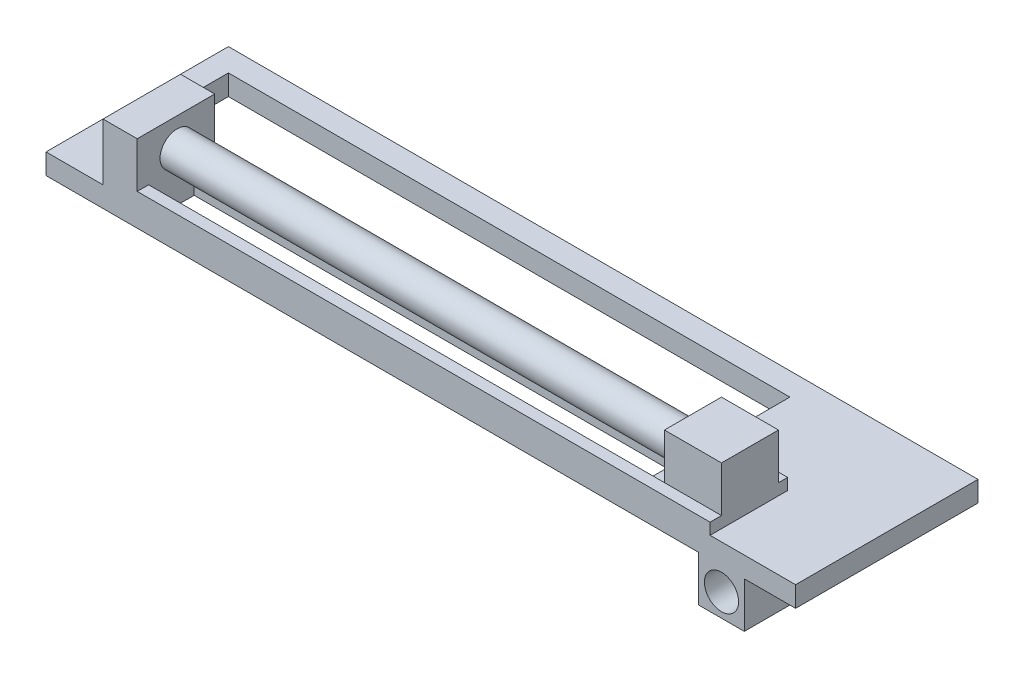
ISO-10303-21;
HEADER;
FILE_DESCRIPTION(('STEP AP214'),'2;1');
FILE_NAME('part.step','',(''),(''),'','','');
FILE_SCHEMA(('AUTOMOTIVE_DESIGN { 1 0 10303 214 1 1 1 1 }'));
ENDSEC;
DATA;
#1=APPLICATION_CONTEXT('core data for automotive mechanical design processes');
#2=APPLICATION_PROTOCOL_DEFINITION('international standard','automotive_design',2000,#1);
#3=PRODUCT_CONTEXT('',#1,'mechanical');
#4=PRODUCT('Part','Part','',(#3));
#5=PRODUCT_RELATED_PRODUCT_CATEGORY('part','',(#4));
#6=PRODUCT_DEFINITION_FORMATION('','',#4);
#7=PRODUCT_DEFINITION_CONTEXT('part definition',#1,'design');
#8=PRODUCT_DEFINITION('design','',#6,#7);
#9=PRODUCT_DEFINITION_SHAPE('','',#8);
#10=(LENGTH_UNIT() NAMED_UNIT(*) SI_UNIT(.MILLI.,.METRE.));
#11=(NAMED_UNIT(*) PLANE_ANGLE_UNIT() SI_UNIT($,.RADIAN.));
#12=(NAMED_UNIT(*) SI_UNIT($,.STERADIAN.) SOLID_ANGLE_UNIT());
#13=UNCERTAINTY_MEASURE_WITH_UNIT(LENGTH_MEASURE(1.E-05),#10,'distance_accuracy_value','');
#14=(GEOMETRIC_REPRESENTATION_CONTEXT(3) GLOBAL_UNCERTAINTY_ASSIGNED_CONTEXT((#13)) GLOBAL_UNIT_ASSIGNED_CONTEXT((#10,
#11,#12)) REPRESENTATION_CONTEXT('',''));
#15=CARTESIAN_POINT('',(0.,0.,0.));
#16=DIRECTION('',(0.,0.,1.));
#17=DIRECTION('',(1.,0.,0.));
#18=AXIS2_PLACEMENT_3D('',#15,#16,#17);
#19=CARTESIAN_POINT('',(0.,3.6,-4.));
#20=DIRECTION('',(0.,-1.,0.));
#21=DIRECTION('',(0.,0.,-1.));
#22=AXIS2_PLACEMENT_3D('',#19,#20,#21);
#23=PLANE('',#22);
#24=DIRECTION('',(1.,0.,0.));
#25=VECTOR('',#24,1.);
#26=CARTESIAN_POINT('',(16.,3.6,-12.));
#27=LINE('',#26,#25);
#28=CARTESIAN_POINT('',(16.,3.6,-12.));
#29=VERTEX_POINT('',#28);
#30=CARTESIAN_POINT('',(106.5,3.6,-12.));
#31=VERTEX_POINT('',#30);
#32=EDGE_CURVE('E476',#29,#31,#27,.T.);
#33=ORIENTED_EDGE('',*,*,#32,.F.);
#34=DIRECTION('',(0.,0.,1.));
#35=VECTOR('',#34,1.);
#36=CARTESIAN_POINT('',(16.,3.6,-13.6));
#37=LINE('',#36,#35);
#38=CARTESIAN_POINT('',(16.,3.6,-10.));
#39=VERTEX_POINT('',#38);
#40=EDGE_CURVE('E249',#29,#39,#37,.T.);
#41=ORIENTED_EDGE('',*,*,#40,.T.);
#42=DIRECTION('',(1.,0.,0.));
#43=VECTOR('',#42,1.);
#44=CARTESIAN_POINT('',(-0.002000000000002,3.6,-10.));
#45=LINE('',#44,#43);
#46=CARTESIAN_POINT('',(102.5,3.6,-10.));
#47=VERTEX_POINT('',#46);
#48=EDGE_CURVE('E348',#39,#47,#45,.T.);
#49=ORIENTED_EDGE('',*,*,#48,.T.);
#50=DIRECTION('',(0.,0.,1.));
#51=VECTOR('',#50,1.);
#52=CARTESIAN_POINT('',(102.5,3.6,-32.002));
#53=LINE('',#52,#51);
#54=CARTESIAN_POINT('',(102.5,3.6,-4.));
#55=VERTEX_POINT('',#54);
#56=EDGE_CURVE('E367',#47,#55,#53,.T.);
#57=ORIENTED_EDGE('',*,*,#56,.T.);
#58=DIRECTION('',(1.,0.,0.));
#59=VECTOR('',#58,1.);
#60=CARTESIAN_POINT('',(0.,3.6,-4.));
#61=LINE('',#60,#59);
#62=CARTESIAN_POINT('',(16.,3.6,-4.));
#63=VERTEX_POINT('',#62);
#64=EDGE_CURVE('E428',#63,#55,#61,.T.);
#65=ORIENTED_EDGE('',*,*,#64,.F.);
#66=CARTESIAN_POINT('',(16.,3.6,-2.));
#67=VERTEX_POINT('',#66);
#68=EDGE_CURVE('E292',#63,#67,#37,.T.);
#69=ORIENTED_EDGE('',*,*,#68,.T.);
#70=DIRECTION('',(1.,0.,0.));
#71=VECTOR('',#70,1.);
#72=CARTESIAN_POINT('',(16.,3.6,-2.));
#73=LINE('',#72,#71);
#74=CARTESIAN_POINT('',(106.5,3.6,-2.));
#75=VERTEX_POINT('',#74);
#76=EDGE_CURVE('E252',#67,#75,#73,.T.);
#77=ORIENTED_EDGE('',*,*,#76,.T.);
#78=DIRECTION('',(0.,0.,1.));
#79=VECTOR('',#78,1.);
#80=CARTESIAN_POINT('',(106.5,3.6,-12.));
#81=LINE('',#80,#79);
#82=EDGE_CURVE('E315',#31,#75,#81,.T.);
#83=ORIENTED_EDGE('',*,*,#82,.F.);
#84=EDGE_LOOP('',(#33,#41,#49,#57,#65,#69,#77,#83));
#85=FACE_BOUND('',#84,.T.);
#86=ADVANCED_FACE('F38',(#85),#23,.F.);
#87=DIRECTION('',(-1.,0.,0.));
#88=VECTOR('',#87,1.);
#89=CARTESIAN_POINT('',(16.,3.6,-13.6));
#90=LINE('',#89,#88);
#91=CARTESIAN_POINT('',(116.5,3.6,-13.6));
#92=VERTEX_POINT('',#91);
#93=CARTESIAN_POINT('',(102.5,3.6,-13.6));
#94=VERTEX_POINT('',#93);
#95=EDGE_CURVE('E244',#92,#94,#90,.T.);
#96=ORIENTED_EDGE('',*,*,#95,.F.);
#97=DIRECTION('',(0.,0.,1.));
#98=VECTOR('',#97,1.);
#99=CARTESIAN_POINT('',(116.5,3.6,-12.));
#100=LINE('',#99,#98);
#101=CARTESIAN_POINT('',(116.5,3.6,0.));
#102=VERTEX_POINT('',#101);
#103=EDGE_CURVE('E311',#92,#102,#100,.T.);
#104=ORIENTED_EDGE('',*,*,#103,.T.);
#105=DIRECTION('',(1.,0.,0.));
#106=VECTOR('',#105,1.);
#107=CARTESIAN_POINT('',(0.,3.6,0.));
#108=LINE('',#107,#106);
#109=CARTESIAN_POINT('',(131.5,3.6,0.));
#110=VERTEX_POINT('',#109);
#111=EDGE_CURVE('E427',#102,#110,#108,.T.);
#112=ORIENTED_EDGE('',*,*,#111,.T.);
#113=DIRECTION('',(0.,0.,1.));
#114=VECTOR('',#113,1.);
#115=CARTESIAN_POINT('',(131.5,3.6,-4.));
#116=LINE('',#115,#114);
#117=CARTESIAN_POINT('',(131.5,3.6,-32.));
#118=VERTEX_POINT('',#117);
#119=EDGE_CURVE('E390',#118,#110,#116,.T.);
#120=ORIENTED_EDGE('',*,*,#119,.F.);
#121=DIRECTION('',(1.,0.,0.));
#122=VECTOR('',#121,1.);
#123=CARTESIAN_POINT('',(0.,3.6,-32.));
#124=LINE('',#123,#122);
#125=CARTESIAN_POINT('',(0.,3.6,-32.));
#126=VERTEX_POINT('',#125);
#127=EDGE_CURVE('E412',#126,#118,#124,.T.);
#128=ORIENTED_EDGE('',*,*,#127,.F.);
#129=DIRECTION('',(0.,0.,1.));
#130=VECTOR('',#129,1.);
#131=CARTESIAN_POINT('',(0.,3.6,-4.));
#132=LINE('',#131,#130);
#133=CARTESIAN_POINT('',(0.,3.6,0.));
#134=VERTEX_POINT('',#133);
#135=EDGE_CURVE('E433',#126,#134,#132,.T.);
#136=ORIENTED_EDGE('',*,*,#135,.T.);
#137=CARTESIAN_POINT('',(10.,3.6,0.));
#138=VERTEX_POINT('',#137);
#139=EDGE_CURVE('E434',#134,#138,#108,.T.);
#140=ORIENTED_EDGE('',*,*,#139,.T.);
#141=DIRECTION('',(0.,0.,1.));
#142=VECTOR('',#141,1.);
#143=CARTESIAN_POINT('',(10.,3.6,-13.6));
#144=LINE('',#143,#142);
#145=CARTESIAN_POINT('',(10.,3.6,-13.6));
#146=VERTEX_POINT('',#145);
#147=EDGE_CURVE('E278',#146,#138,#144,.T.);
#148=ORIENTED_EDGE('',*,*,#147,.F.);
#149=DIRECTION('',(1.,0.,0.));
#150=VECTOR('',#149,1.);
#151=CARTESIAN_POINT('',(-0.002000000000002,3.6,-13.6));
#152=LINE('',#151,#150);
#153=CARTESIAN_POINT('',(4.,3.6,-13.6));
#154=VERTEX_POINT('',#153);
#155=EDGE_CURVE('E350',#154,#146,#152,.T.);
#156=ORIENTED_EDGE('',*,*,#155,.F.);
#157=DIRECTION('',(0.,0.,1.));
#158=VECTOR('',#157,1.);
#159=CARTESIAN_POINT('',(4.,3.6,-32.));
#160=LINE('',#159,#158);
#161=CARTESIAN_POINT('',(4.,3.6,-28.));
#162=VERTEX_POINT('',#161);
#163=EDGE_CURVE('E424',#162,#154,#160,.T.);
#164=ORIENTED_EDGE('',*,*,#163,.F.);
#165=DIRECTION('',(-1.,0.,0.));
#166=VECTOR('',#165,1.);
#167=CARTESIAN_POINT('',(132.881449618829,3.6,-28.));
#168=LINE('',#167,#166);
#169=CARTESIAN_POINT('',(102.5,3.6,-28.));
#170=VERTEX_POINT('',#169);
#171=EDGE_CURVE('E406',#170,#162,#168,.T.);
#172=ORIENTED_EDGE('',*,*,#171,.F.);
#173=EDGE_CURVE('E364',#170,#94,#53,.T.);
#174=ORIENTED_EDGE('',*,*,#173,.T.);
#175=EDGE_LOOP('',(#96,#104,#112,#120,#128,#136,#140,#148,#156,#164,#172,#174));
#176=FACE_BOUND('',#175,.T.);
#177=ADVANCED_FACE('F459',(#176),#23,.F.);
#178=CARTESIAN_POINT('',(16.,0.,0.00200000000000027));
#179=DIRECTION('',(-1.,0.,0.));
#180=DIRECTION('',(0.,0.,1.));
#181=AXIS2_PLACEMENT_3D('',#178,#179,#180);
#182=PLANE('',#181);
#183=CARTESIAN_POINT('',(16.,8.6,-7.));
#184=DIRECTION('',(-1.,0.,0.));
#185=DIRECTION('',(0.,0.,1.));
#186=AXIS2_PLACEMENT_3D('',#183,#184,#185);
#187=CIRCLE('',#186,3.);
#188=CARTESIAN_POINT('',(16.,8.6,-4.));
#189=VERTEX_POINT('',#188);
#190=EDGE_CURVE('E45',#189,#189,#187,.F.);
#191=ORIENTED_EDGE('',*,*,#190,.F.);
#192=EDGE_LOOP('',(#191));
#193=FACE_BOUND('',#192,.T.);
#194=DIRECTION('',(0.,-1.,0.));
#195=VECTOR('',#194,1.);
#196=CARTESIAN_POINT('',(16.,5.6,-12.));
#197=LINE('',#196,#195);
#198=CARTESIAN_POINT('',(16.,5.6,-12.));
#199=VERTEX_POINT('',#198);
#200=EDGE_CURVE('E232',#199,#29,#197,.T.);
#201=ORIENTED_EDGE('',*,*,#200,.F.);
#202=DIRECTION('',(0.,0.,1.));
#203=VECTOR('',#202,1.);
#204=CARTESIAN_POINT('',(16.,5.6,-13.6));
#205=LINE('',#204,#203);
#206=CARTESIAN_POINT('',(16.,5.6,-13.6));
#207=VERTEX_POINT('',#206);
#208=EDGE_CURVE('E240',#207,#199,#205,.T.);
#209=ORIENTED_EDGE('',*,*,#208,.F.);
#210=DIRECTION('',(0.,-1.,0.));
#211=VECTOR('',#210,1.);
#212=CARTESIAN_POINT('',(16.,13.6,-13.6));
#213=LINE('',#212,#211);
#214=CARTESIAN_POINT('',(16.,13.6,-13.6));
#215=VERTEX_POINT('',#214);
#216=EDGE_CURVE('E298',#215,#207,#213,.T.);
#217=ORIENTED_EDGE('',*,*,#216,.F.);
#218=DIRECTION('',(0.,0.,1.));
#219=VECTOR('',#218,1.);
#220=CARTESIAN_POINT('',(16.,13.6,-13.6));
#221=LINE('',#220,#219);
#222=CARTESIAN_POINT('',(16.,13.6,0.));
#223=VERTEX_POINT('',#222);
#224=EDGE_CURVE('E286',#215,#223,#221,.T.);
#225=ORIENTED_EDGE('',*,*,#224,.T.);
#226=DIRECTION('',(0.,-1.,0.));
#227=VECTOR('',#226,1.);
#228=CARTESIAN_POINT('',(16.,13.6,0.));
#229=LINE('',#228,#227);
#230=CARTESIAN_POINT('',(16.,5.6,0.));
#231=VERTEX_POINT('',#230);
#232=EDGE_CURVE('E294',#223,#231,#229,.T.);
#233=ORIENTED_EDGE('',*,*,#232,.T.);
#234=DIRECTION('',(0.,0.,-1.));
#235=VECTOR('',#234,1.);
#236=CARTESIAN_POINT('',(16.,5.6,0.));
#237=LINE('',#236,#235);
#238=CARTESIAN_POINT('',(16.,5.6,-2.));
#239=VERTEX_POINT('',#238);
#240=EDGE_CURVE('E264',#231,#239,#237,.T.);
#241=ORIENTED_EDGE('',*,*,#240,.T.);
#242=DIRECTION('',(0.,-1.,0.));
#243=VECTOR('',#242,1.);
#244=CARTESIAN_POINT('',(16.,5.6,-2.));
#245=LINE('',#244,#243);
#246=EDGE_CURVE('E270',#239,#67,#245,.T.);
#247=ORIENTED_EDGE('',*,*,#246,.T.);
#248=ORIENTED_EDGE('',*,*,#68,.F.);
#249=DIRECTION('',(0.,1.,0.));
#250=VECTOR('',#249,1.);
#251=CARTESIAN_POINT('',(16.,0.,-4.));
#252=LINE('',#251,#250);
#253=CARTESIAN_POINT('',(16.,0.,-4.));
#254=VERTEX_POINT('',#253);
#255=EDGE_CURVE('E309',#254,#63,#252,.T.);
#256=ORIENTED_EDGE('',*,*,#255,.F.);
#257=DIRECTION('',(0.,0.,-1.));
#258=VECTOR('',#257,1.);
#259=CARTESIAN_POINT('',(16.,0.,0.00200000000000027));
#260=LINE('',#259,#258);
#261=CARTESIAN_POINT('',(16.,0.,-10.));
#262=VERTEX_POINT('',#261);
#263=EDGE_CURVE('E306',#254,#262,#260,.T.);
#264=ORIENTED_EDGE('',*,*,#263,.T.);
#265=DIRECTION('',(0.,1.,0.));
#266=VECTOR('',#265,1.);
#267=CARTESIAN_POINT('',(16.,0.,-10.));
#268=LINE('',#267,#266);
#269=EDGE_CURVE('E297',#262,#39,#268,.T.);
#270=ORIENTED_EDGE('',*,*,#269,.T.);
#271=ORIENTED_EDGE('',*,*,#40,.F.);
#272=EDGE_LOOP('',(#201,#209,#217,#225,#233,#241,#247,#248,#256,#264,#270,#271));
#273=FACE_BOUND('',#272,.T.);
#274=ADVANCED_FACE('F247',(#193,#273),#182,.F.);
#275=CARTESIAN_POINT('',(0.,0.,-4.));
#276=DIRECTION('',(0.,0.,1.));
#277=DIRECTION('',(1.,0.,0.));
#278=AXIS2_PLACEMENT_3D('',#275,#276,#277);
#279=PLANE('',#278);
#280=ORIENTED_EDGE('',*,*,#255,.T.);
#281=ORIENTED_EDGE('',*,*,#64,.T.);
#282=DIRECTION('',(0.,-1.,0.));
#283=VECTOR('',#282,1.);
#284=CARTESIAN_POINT('',(102.5,3.6,-4.));
#285=LINE('',#284,#283);
#286=CARTESIAN_POINT('',(102.5,0.,-4.));
#287=VERTEX_POINT('',#286);
#288=EDGE_CURVE('E360',#55,#287,#285,.T.);
#289=ORIENTED_EDGE('',*,*,#288,.T.);
#290=DIRECTION('',(1.,0.,0.));
#291=VECTOR('',#290,1.);
#292=CARTESIAN_POINT('',(0.,0.,-4.));
#293=LINE('',#292,#291);
#294=EDGE_CURVE('E430',#254,#287,#293,.T.);
#295=ORIENTED_EDGE('',*,*,#294,.F.);
#296=EDGE_LOOP('',(#280,#281,#289,#295));
#297=FACE_BOUND('',#296,.T.);
#298=ADVANCED_FACE('F458',(#297),#279,.F.);
#299=CARTESIAN_POINT('',(-0.002000000000002,3.6,-10.));
#300=DIRECTION('',(0.,0.,1.));
#301=DIRECTION('',(0.,-1.,0.));
#302=AXIS2_PLACEMENT_3D('',#299,#300,#301);
#303=PLANE('',#302);
#304=ORIENTED_EDGE('',*,*,#48,.F.);
#305=ORIENTED_EDGE('',*,*,#269,.F.);
#306=DIRECTION('',(1.,0.,0.));
#307=VECTOR('',#306,1.);
#308=CARTESIAN_POINT('',(-0.002000000000002,0.,-10.));
#309=LINE('',#308,#307);
#310=CARTESIAN_POINT('',(102.5,0.,-10.));
#311=VERTEX_POINT('',#310);
#312=EDGE_CURVE('E345',#262,#311,#309,.T.);
#313=ORIENTED_EDGE('',*,*,#312,.T.);
#314=DIRECTION('',(0.,-1.,0.));
#315=VECTOR('',#314,1.);
#316=CARTESIAN_POINT('',(102.5,3.6,-10.));
#317=LINE('',#316,#315);
#318=EDGE_CURVE('E338',#47,#311,#317,.T.);
#319=ORIENTED_EDGE('',*,*,#318,.F.);
#320=EDGE_LOOP('',(#304,#305,#313,#319));
#321=FACE_BOUND('',#320,.T.);
#322=ADVANCED_FACE('F465',(#321),#303,.T.);
#323=CARTESIAN_POINT('',(4.,3.6,-32.));
#324=DIRECTION('',(-1.,0.,0.));
#325=DIRECTION('',(0.,0.,1.));
#326=AXIS2_PLACEMENT_3D('',#323,#324,#325);
#327=PLANE('',#326);
#328=DIRECTION('',(0.,-1.,0.));
#329=VECTOR('',#328,1.);
#330=CARTESIAN_POINT('',(4.,3.6,-13.6));
#331=LINE('',#330,#329);
#332=CARTESIAN_POINT('',(4.,0.,-13.6));
#333=VERTEX_POINT('',#332);
#334=EDGE_CURVE('E347',#154,#333,#331,.T.);
#335=ORIENTED_EDGE('',*,*,#334,.T.);
#336=DIRECTION('',(0.,0.,1.));
#337=VECTOR('',#336,1.);
#338=CARTESIAN_POINT('',(4.,0.,-32.));
#339=LINE('',#338,#337);
#340=CARTESIAN_POINT('',(4.,0.,-28.));
#341=VERTEX_POINT('',#340);
#342=EDGE_CURVE('E421',#341,#333,#339,.T.);
#343=ORIENTED_EDGE('',*,*,#342,.F.);
#344=DIRECTION('',(0.,-1.,0.));
#345=VECTOR('',#344,1.);
#346=CARTESIAN_POINT('',(4.,3.6,-28.));
#347=LINE('',#346,#345);
#348=EDGE_CURVE('E402',#162,#341,#347,.T.);
#349=ORIENTED_EDGE('',*,*,#348,.F.);
#350=ORIENTED_EDGE('',*,*,#163,.T.);
#351=EDGE_LOOP('',(#335,#343,#349,#350));
#352=FACE_BOUND('',#351,.T.);
#353=ADVANCED_FACE('F539',(#352),#327,.F.);
#354=CARTESIAN_POINT('',(102.5,3.6,-32.002));
#355=DIRECTION('',(-1.,0.,0.));
#356=DIRECTION('',(0.,0.,1.));
#357=AXIS2_PLACEMENT_3D('',#354,#355,#356);
#358=PLANE('',#357);
#359=DIRECTION('',(0.,0.,1.));
#360=VECTOR('',#359,1.);
#361=CARTESIAN_POINT('',(102.5,0.,-32.002));
#362=LINE('',#361,#360);
#363=CARTESIAN_POINT('',(102.5,0.,-28.));
#364=VERTEX_POINT('',#363);
#365=CARTESIAN_POINT('',(102.5,0.,-13.6));
#366=VERTEX_POINT('',#365);
#367=EDGE_CURVE('E365',#364,#366,#362,.T.);
#368=ORIENTED_EDGE('',*,*,#367,.T.);
#369=DIRECTION('',(0.,-1.,0.));
#370=VECTOR('',#369,1.);
#371=CARTESIAN_POINT('',(102.5,3.6,-13.6));
#372=LINE('',#371,#370);
#373=EDGE_CURVE('E339',#94,#366,#372,.T.);
#374=ORIENTED_EDGE('',*,*,#373,.F.);
#375=ORIENTED_EDGE('',*,*,#173,.F.);
#376=DIRECTION('',(0.,-1.,0.));
#377=VECTOR('',#376,1.);
#378=CARTESIAN_POINT('',(102.5,3.6,-28.));
#379=LINE('',#378,#377);
#380=EDGE_CURVE('E357',#170,#364,#379,.T.);
#381=ORIENTED_EDGE('',*,*,#380,.T.);
#382=EDGE_LOOP('',(#368,#374,#375,#381));
#383=FACE_BOUND('',#382,.T.);
#384=ADVANCED_FACE('F526',(#383),#358,.T.);
#385=CARTESIAN_POINT('',(0.,0.,-4.));
#386=DIRECTION('',(0.,-1.,0.));
#387=DIRECTION('',(0.,0.,-1.));
#388=AXIS2_PLACEMENT_3D('',#385,#386,#387);
#389=PLANE('',#388);
#390=DIRECTION('',(1.,0.,0.));
#391=VECTOR('',#390,1.);
#392=CARTESIAN_POINT('',(0.,0.,0.));
#393=LINE('',#392,#391);
#394=CARTESIAN_POINT('',(122.5,0.,0.));
#395=VERTEX_POINT('',#394);
#396=CARTESIAN_POINT('',(131.5,0.,0.));
#397=VERTEX_POINT('',#396);
#398=EDGE_CURVE('E439',#395,#397,#393,.T.);
#399=ORIENTED_EDGE('',*,*,#398,.F.);
#400=DIRECTION('',(0.,0.,-1.));
#401=VECTOR('',#400,1.);
#402=CARTESIAN_POINT('',(122.5,0.,0.));
#403=LINE('',#402,#401);
#404=CARTESIAN_POINT('',(122.5,0.,-32.));
#405=VERTEX_POINT('',#404);
#406=EDGE_CURVE('E386',#395,#405,#403,.T.);
#407=ORIENTED_EDGE('',*,*,#406,.T.);
#408=DIRECTION('',(1.,0.,0.));
#409=VECTOR('',#408,1.);
#410=CARTESIAN_POINT('',(0.,0.,-32.));
#411=LINE('',#410,#409);
#412=CARTESIAN_POINT('',(131.5,0.,-32.));
#413=VERTEX_POINT('',#412);
#414=EDGE_CURVE('E414',#405,#413,#411,.T.);
#415=ORIENTED_EDGE('',*,*,#414,.T.);
#416=DIRECTION('',(0.,0.,1.));
#417=VECTOR('',#416,1.);
#418=CARTESIAN_POINT('',(131.5,0.,-4.));
#419=LINE('',#418,#417);
#420=EDGE_CURVE('E448',#413,#397,#419,.T.);
#421=ORIENTED_EDGE('',*,*,#420,.T.);
#422=EDGE_LOOP('',(#399,#407,#415,#421));
#423=FACE_BOUND('',#422,.T.);
#424=ADVANCED_FACE('F538',(#423),#389,.T.);
#425=CARTESIAN_POINT('',(131.5,0.,-4.));
#426=DIRECTION('',(1.,0.,0.));
#427=DIRECTION('',(0.,0.,-1.));
#428=AXIS2_PLACEMENT_3D('',#425,#426,#427);
#429=PLANE('',#428);
#430=DIRECTION('',(0.,1.,0.));
#431=VECTOR('',#430,1.);
#432=CARTESIAN_POINT('',(131.5,0.,0.));
#433=LINE('',#432,#431);
#434=EDGE_CURVE('E436',#397,#110,#433,.T.);
#435=ORIENTED_EDGE('',*,*,#434,.F.);
#436=ORIENTED_EDGE('',*,*,#420,.F.);
#437=DIRECTION('',(0.,-1.,0.));
#438=VECTOR('',#437,1.);
#439=CARTESIAN_POINT('',(131.5,3.6,-32.));
#440=LINE('',#439,#438);
#441=EDGE_CURVE('E408',#118,#413,#440,.T.);
#442=ORIENTED_EDGE('',*,*,#441,.F.);
#443=ORIENTED_EDGE('',*,*,#119,.T.);
#444=EDGE_LOOP('',(#435,#436,#442,#443));
#445=FACE_BOUND('',#444,.T.);
#446=ADVANCED_FACE('F545',(#445),#429,.T.);
#447=ORIENTED_EDGE('',*,*,#263,.F.);
#448=ORIENTED_EDGE('',*,*,#294,.T.);
#449=EDGE_CURVE('E359',#311,#287,#362,.T.);
#450=ORIENTED_EDGE('',*,*,#449,.F.);
#451=ORIENTED_EDGE('',*,*,#312,.F.);
#452=EDGE_LOOP('',(#447,#448,#450,#451));
#453=FACE_BOUND('',#452,.T.);
#454=ORIENTED_EDGE('',*,*,#342,.T.);
#455=DIRECTION('',(1.,0.,0.));
#456=VECTOR('',#455,1.);
#457=CARTESIAN_POINT('',(-0.002000000000002,0.,-13.6));
#458=LINE('',#457,#456);
#459=EDGE_CURVE('E342',#333,#366,#458,.T.);
#460=ORIENTED_EDGE('',*,*,#459,.T.);
#461=ORIENTED_EDGE('',*,*,#367,.F.);
#462=DIRECTION('',(-1.,0.,0.));
#463=VECTOR('',#462,1.);
#464=CARTESIAN_POINT('',(132.881449618829,0.,-28.));
#465=LINE('',#464,#463);
#466=EDGE_CURVE('E405',#364,#341,#465,.T.);
#467=ORIENTED_EDGE('',*,*,#466,.T.);
#468=EDGE_LOOP('',(#454,#460,#461,#467));
#469=FACE_BOUND('',#468,.T.);
#470=DIRECTION('',(0.,0.,-1.));
#471=VECTOR('',#470,1.);
#472=CARTESIAN_POINT('',(114.5,0.,0.));
#473=LINE('',#472,#471);
#474=CARTESIAN_POINT('',(114.5,0.,0.));
#475=VERTEX_POINT('',#474);
#476=CARTESIAN_POINT('',(114.5,0.,-32.));
#477=VERTEX_POINT('',#476);
#478=EDGE_CURVE('E389',#475,#477,#473,.T.);
#479=ORIENTED_EDGE('',*,*,#478,.F.);
#480=CARTESIAN_POINT('',(0.,0.,0.));
#481=VERTEX_POINT('',#480);
#482=EDGE_CURVE('E440',#481,#475,#393,.T.);
#483=ORIENTED_EDGE('',*,*,#482,.F.);
#484=DIRECTION('',(0.,0.,1.));
#485=VECTOR('',#484,1.);
#486=CARTESIAN_POINT('',(0.,0.,-4.));
#487=LINE('',#486,#485);
#488=CARTESIAN_POINT('',(0.,0.,-32.));
#489=VERTEX_POINT('',#488);
#490=EDGE_CURVE('E446',#489,#481,#487,.T.);
#491=ORIENTED_EDGE('',*,*,#490,.F.);
#492=EDGE_CURVE('E415',#489,#477,#411,.T.);
#493=ORIENTED_EDGE('',*,*,#492,.T.);
#494=EDGE_LOOP('',(#479,#483,#491,#493));
#495=FACE_BOUND('',#494,.T.);
#496=ADVANCED_FACE('F513',(#453,#469,#495),#389,.T.);
#497=CARTESIAN_POINT('',(0.,0.,-4.));
#498=DIRECTION('',(1.,0.,0.));
#499=DIRECTION('',(0.,0.,-1.));
#500=AXIS2_PLACEMENT_3D('',#497,#498,#499);
#501=PLANE('',#500);
#502=DIRECTION('',(0.,1.,0.));
#503=VECTOR('',#502,1.);
#504=CARTESIAN_POINT('',(0.,0.,0.));
#505=LINE('',#504,#503);
#506=EDGE_CURVE('E431',#481,#134,#505,.T.);
#507=ORIENTED_EDGE('',*,*,#506,.T.);
#508=ORIENTED_EDGE('',*,*,#135,.F.);
#509=DIRECTION('',(0.,-1.,0.));
#510=VECTOR('',#509,1.);
#511=CARTESIAN_POINT('',(0.,3.6,-32.));
#512=LINE('',#511,#510);
#513=EDGE_CURVE('E418',#126,#489,#512,.T.);
#514=ORIENTED_EDGE('',*,*,#513,.T.);
#515=ORIENTED_EDGE('',*,*,#490,.T.);
#516=EDGE_LOOP('',(#507,#508,#514,#515));
#517=FACE_BOUND('',#516,.T.);
#518=ADVANCED_FACE('F632',(#517),#501,.F.);
#519=CARTESIAN_POINT('',(0.,0.,0.));
#520=DIRECTION('',(0.,0.,1.));
#521=DIRECTION('',(1.,0.,0.));
#522=AXIS2_PLACEMENT_3D('',#519,#520,#521);
#523=PLANE('',#522);
#524=ORIENTED_EDGE('',*,*,#111,.F.);
#525=DIRECTION('',(0.,-1.,0.));
#526=VECTOR('',#525,1.);
#527=CARTESIAN_POINT('',(116.5,5.6,0.));
#528=LINE('',#527,#526);
#529=CARTESIAN_POINT('',(116.5,5.6,0.));
#530=VERTEX_POINT('',#529);
#531=EDGE_CURVE('E267',#530,#102,#528,.T.);
#532=ORIENTED_EDGE('',*,*,#531,.F.);
#533=DIRECTION('',(1.,0.,0.));
#534=VECTOR('',#533,1.);
#535=CARTESIAN_POINT('',(16.,5.6,0.));
#536=LINE('',#535,#534);
#537=EDGE_CURVE('E262',#231,#530,#536,.T.);
#538=ORIENTED_EDGE('',*,*,#537,.F.);
#539=ORIENTED_EDGE('',*,*,#232,.F.);
#540=DIRECTION('',(-1.,0.,0.));
#541=VECTOR('',#540,1.);
#542=CARTESIAN_POINT('',(16.,13.6,0.));
#543=LINE('',#542,#541);
#544=CARTESIAN_POINT('',(10.,13.6,0.));
#545=VERTEX_POINT('',#544);
#546=EDGE_CURVE('E279',#223,#545,#543,.T.);
#547=ORIENTED_EDGE('',*,*,#546,.T.);
#548=DIRECTION('',(0.,-1.,0.));
#549=VECTOR('',#548,1.);
#550=CARTESIAN_POINT('',(10.,13.6,0.));
#551=LINE('',#550,#549);
#552=EDGE_CURVE('E289',#545,#138,#551,.T.);
#553=ORIENTED_EDGE('',*,*,#552,.T.);
#554=ORIENTED_EDGE('',*,*,#139,.F.);
#555=ORIENTED_EDGE('',*,*,#506,.F.);
#556=ORIENTED_EDGE('',*,*,#482,.T.);
#557=DIRECTION('',(0.,1.,0.));
#558=VECTOR('',#557,1.);
#559=CARTESIAN_POINT('',(114.5,-8.,0.));
#560=LINE('',#559,#558);
#561=CARTESIAN_POINT('',(114.5,-8.,0.));
#562=VERTEX_POINT('',#561);
#563=EDGE_CURVE('E394',#562,#475,#560,.T.);
#564=ORIENTED_EDGE('',*,*,#563,.F.);
#565=DIRECTION('',(1.,0.,0.));
#566=VECTOR('',#565,1.);
#567=CARTESIAN_POINT('',(114.5,-8.,0.));
#568=LINE('',#567,#566);
#569=CARTESIAN_POINT('',(122.5,-8.,0.));
#570=VERTEX_POINT('',#569);
#571=EDGE_CURVE('E380',#562,#570,#568,.T.);
#572=ORIENTED_EDGE('',*,*,#571,.T.);
#573=DIRECTION('',(0.,1.,0.));
#574=VECTOR('',#573,1.);
#575=CARTESIAN_POINT('',(122.5,-8.,0.));
#576=LINE('',#575,#574);
#577=EDGE_CURVE('E397',#570,#395,#576,.T.);
#578=ORIENTED_EDGE('',*,*,#577,.T.);
#579=ORIENTED_EDGE('',*,*,#398,.T.);
#580=ORIENTED_EDGE('',*,*,#434,.T.);
#581=EDGE_LOOP('',(#524,#532,#538,#539,#547,#553,#554,#555,#556,#564,#572,#578,#579,#580));
#582=FACE_BOUND('',#581,.T.);
#583=CARTESIAN_POINT('',(118.5,-4.,0.));
#584=DIRECTION('',(0.,0.,1.));
#585=DIRECTION('',(1.,0.,0.));
#586=AXIS2_PLACEMENT_3D('',#583,#584,#585);
#587=CIRCLE('',#586,3.00000000000001);
#588=CARTESIAN_POINT('',(121.5,-4.,0.));
#589=VERTEX_POINT('',#588);
#590=EDGE_CURVE('E370',#589,#589,#587,.T.);
#591=ORIENTED_EDGE('',*,*,#590,.F.);
#592=EDGE_LOOP('',(#591));
#593=FACE_BOUND('',#592,.T.);
#594=ADVANCED_FACE('F497',(#582,#593),#523,.T.);
#595=CARTESIAN_POINT('',(0.,0.,-32.));
#596=DIRECTION('',(0.,0.,-1.));
#597=DIRECTION('',(-1.,0.,0.));
#598=AXIS2_PLACEMENT_3D('',#595,#596,#597);
#599=PLANE('',#598);
#600=CARTESIAN_POINT('',(118.5,-4.,-32.));
#601=DIRECTION('',(0.,0.,-1.));
#602=DIRECTION('',(-1.,0.,0.));
#603=AXIS2_PLACEMENT_3D('',#600,#601,#602);
#604=CIRCLE('',#603,3.00000000000001);
#605=CARTESIAN_POINT('',(115.5,-4.,-32.));
#606=VERTEX_POINT('',#605);
#607=EDGE_CURVE('E363',#606,#606,#604,.F.);
#608=ORIENTED_EDGE('',*,*,#607,.T.);
#609=EDGE_LOOP('',(#608));
#610=FACE_BOUND('',#609,.T.);
#611=ORIENTED_EDGE('',*,*,#127,.T.);
#612=ORIENTED_EDGE('',*,*,#441,.T.);
#613=ORIENTED_EDGE('',*,*,#414,.F.);
#614=DIRECTION('',(0.,1.,0.));
#615=VECTOR('',#614,1.);
#616=CARTESIAN_POINT('',(122.5,-8.,-32.));
#617=LINE('',#616,#615);
#618=CARTESIAN_POINT('',(122.5,-8.,-32.));
#619=VERTEX_POINT('',#618);
#620=EDGE_CURVE('E400',#619,#405,#617,.T.);
#621=ORIENTED_EDGE('',*,*,#620,.F.);
#622=DIRECTION('',(1.,0.,0.));
#623=VECTOR('',#622,1.);
#624=CARTESIAN_POINT('',(114.5,-8.,-32.));
#625=LINE('',#624,#623);
#626=CARTESIAN_POINT('',(114.5,-8.,-32.));
#627=VERTEX_POINT('',#626);
#628=EDGE_CURVE('E373',#627,#619,#625,.T.);
#629=ORIENTED_EDGE('',*,*,#628,.F.);
#630=DIRECTION('',(0.,1.,0.));
#631=VECTOR('',#630,1.);
#632=CARTESIAN_POINT('',(114.5,-8.,-32.));
#633=LINE('',#632,#631);
#634=EDGE_CURVE('E385',#627,#477,#633,.T.);
#635=ORIENTED_EDGE('',*,*,#634,.T.);
#636=ORIENTED_EDGE('',*,*,#492,.F.);
#637=ORIENTED_EDGE('',*,*,#513,.F.);
#638=EDGE_LOOP('',(#611,#612,#613,#621,#629,#635,#636,#637));
#639=FACE_BOUND('',#638,.T.);
#640=ADVANCED_FACE('F692',(#610,#639),#599,.T.);
#641=CARTESIAN_POINT('',(132.881449618829,3.6,-28.));
#642=DIRECTION('',(0.,0.,-1.));
#643=DIRECTION('',(-1.,0.,0.));
#644=AXIS2_PLACEMENT_3D('',#641,#642,#643);
#645=PLANE('',#644);
#646=ORIENTED_EDGE('',*,*,#466,.F.);
#647=ORIENTED_EDGE('',*,*,#380,.F.);
#648=ORIENTED_EDGE('',*,*,#171,.T.);
#649=ORIENTED_EDGE('',*,*,#348,.T.);
#650=EDGE_LOOP('',(#646,#647,#648,#649));
#651=FACE_BOUND('',#650,.T.);
#652=ADVANCED_FACE('F559',(#651),#645,.F.);
#653=CARTESIAN_POINT('',(122.5,-8.,0.));
#654=DIRECTION('',(1.,0.,0.));
#655=DIRECTION('',(0.,0.,-1.));
#656=AXIS2_PLACEMENT_3D('',#653,#654,#655);
#657=PLANE('',#656);
#658=ORIENTED_EDGE('',*,*,#406,.F.);
#659=ORIENTED_EDGE('',*,*,#577,.F.);
#660=DIRECTION('',(0.,0.,-1.));
#661=VECTOR('',#660,1.);
#662=CARTESIAN_POINT('',(122.5,-8.,0.));
#663=LINE('',#662,#661);
#664=EDGE_CURVE('E377',#570,#619,#663,.T.);
#665=ORIENTED_EDGE('',*,*,#664,.T.);
#666=ORIENTED_EDGE('',*,*,#620,.T.);
#667=EDGE_LOOP('',(#658,#659,#665,#666));
#668=FACE_BOUND('',#667,.T.);
#669=ADVANCED_FACE('F670',(#668),#657,.T.);
#670=CARTESIAN_POINT('',(114.5,-8.,0.));
#671=DIRECTION('',(1.,0.,0.));
#672=DIRECTION('',(0.,0.,-1.));
#673=AXIS2_PLACEMENT_3D('',#670,#671,#672);
#674=PLANE('',#673);
#675=ORIENTED_EDGE('',*,*,#563,.T.);
#676=ORIENTED_EDGE('',*,*,#478,.T.);
#677=ORIENTED_EDGE('',*,*,#634,.F.);
#678=DIRECTION('',(0.,0.,-1.));
#679=VECTOR('',#678,1.);
#680=CARTESIAN_POINT('',(114.5,-8.,0.));
#681=LINE('',#680,#679);
#682=EDGE_CURVE('E383',#562,#627,#681,.T.);
#683=ORIENTED_EDGE('',*,*,#682,.F.);
#684=EDGE_LOOP('',(#675,#676,#677,#683));
#685=FACE_BOUND('',#684,.T.);
#686=ADVANCED_FACE('F665',(#685),#674,.F.);
#687=CARTESIAN_POINT('',(0.,-8.,0.));
#688=DIRECTION('',(0.,1.,0.));
#689=DIRECTION('',(0.,0.,1.));
#690=AXIS2_PLACEMENT_3D('',#687,#688,#689);
#691=PLANE('',#690);
#692=ORIENTED_EDGE('',*,*,#628,.T.);
#693=ORIENTED_EDGE('',*,*,#664,.F.);
#694=ORIENTED_EDGE('',*,*,#571,.F.);
#695=ORIENTED_EDGE('',*,*,#682,.T.);
#696=EDGE_LOOP('',(#692,#693,#694,#695));
#697=FACE_BOUND('',#696,.T.);
#698=ADVANCED_FACE('F533',(#697),#691,.F.);
#699=CARTESIAN_POINT('',(118.5,-4.,-32.001));
#700=DIRECTION('',(0.,0.,1.));
#701=DIRECTION('',(1.,0.,0.));
#702=AXIS2_PLACEMENT_3D('',#699,#700,#701);
#703=CYLINDRICAL_SURFACE('',#702,3.00000000000001);
#704=ORIENTED_EDGE('',*,*,#607,.F.);
#705=EDGE_LOOP('',(#704));
#706=FACE_BOUND('',#705,.T.);
#707=ORIENTED_EDGE('',*,*,#590,.T.);
#708=EDGE_LOOP('',(#707));
#709=FACE_BOUND('',#708,.T.);
#710=ADVANCED_FACE('F524',(#706,#709),#703,.F.);
#711=ORIENTED_EDGE('',*,*,#318,.T.);
#712=ORIENTED_EDGE('',*,*,#449,.T.);
#713=ORIENTED_EDGE('',*,*,#288,.F.);
#714=ORIENTED_EDGE('',*,*,#56,.F.);
#715=EDGE_LOOP('',(#711,#712,#713,#714));
#716=FACE_BOUND('',#715,.T.);
#717=ADVANCED_FACE('F522',(#716),#358,.T.);
#718=CARTESIAN_POINT('',(-0.002000000000002,3.6,-13.6));
#719=DIRECTION('',(0.,0.,1.));
#720=DIRECTION('',(1.,0.,0.));
#721=AXIS2_PLACEMENT_3D('',#718,#719,#720);
#722=PLANE('',#721);
#723=ORIENTED_EDGE('',*,*,#95,.T.);
#724=ORIENTED_EDGE('',*,*,#373,.T.);
#725=ORIENTED_EDGE('',*,*,#459,.F.);
#726=ORIENTED_EDGE('',*,*,#334,.F.);
#727=ORIENTED_EDGE('',*,*,#155,.T.);
#728=DIRECTION('',(0.,-1.,0.));
#729=VECTOR('',#728,1.);
#730=CARTESIAN_POINT('',(10.,13.6,-13.6));
#731=LINE('',#730,#729);
#732=CARTESIAN_POINT('',(10.,13.6,-13.6));
#733=VERTEX_POINT('',#732);
#734=EDGE_CURVE('E300',#733,#146,#731,.T.);
#735=ORIENTED_EDGE('',*,*,#734,.F.);
#736=DIRECTION('',(-1.,0.,0.));
#737=VECTOR('',#736,1.);
#738=CARTESIAN_POINT('',(16.,13.6,-13.6));
#739=LINE('',#738,#737);
#740=EDGE_CURVE('E284',#215,#733,#739,.T.);
#741=ORIENTED_EDGE('',*,*,#740,.F.);
#742=ORIENTED_EDGE('',*,*,#216,.T.);
#743=DIRECTION('',(-1.,0.,0.));
#744=VECTOR('',#743,1.);
#745=CARTESIAN_POINT('',(16.,5.6,-13.6));
#746=LINE('',#745,#744);
#747=CARTESIAN_POINT('',(116.5,5.6,-13.6));
#748=VERTEX_POINT('',#747);
#749=EDGE_CURVE('E52',#748,#207,#746,.T.);
#750=ORIENTED_EDGE('',*,*,#749,.F.);
#751=DIRECTION('',(0.,-1.,0.));
#752=VECTOR('',#751,1.);
#753=CARTESIAN_POINT('',(116.5,5.6,-13.6));
#754=LINE('',#753,#752);
#755=EDGE_CURVE('E250',#748,#92,#754,.T.);
#756=ORIENTED_EDGE('',*,*,#755,.T.);
#757=EDGE_LOOP('',(#723,#724,#725,#726,#727,#735,#741,#742,#750,#756));
#758=FACE_BOUND('',#757,.T.);
#759=ADVANCED_FACE('F486',(#758),#722,.F.);
#760=CARTESIAN_POINT('',(106.5,13.6,-2.));
#761=DIRECTION('',(0.,0.,-1.));
#762=DIRECTION('',(-1.,0.,0.));
#763=AXIS2_PLACEMENT_3D('',#760,#761,#762);
#764=PLANE('',#763);
#765=DIRECTION('',(0.,-1.,0.));
#766=VECTOR('',#765,1.);
#767=CARTESIAN_POINT('',(106.5,13.6,-2.));
#768=LINE('',#767,#766);
#769=CARTESIAN_POINT('',(106.5,13.6,-2.));
#770=VERTEX_POINT('',#769);
#771=CARTESIAN_POINT('',(106.5,5.6,-2.));
#772=VERTEX_POINT('',#771);
#773=EDGE_CURVE('E323',#770,#772,#768,.T.);
#774=ORIENTED_EDGE('',*,*,#773,.T.);
#775=DIRECTION('',(1.,0.,0.));
#776=VECTOR('',#775,1.);
#777=CARTESIAN_POINT('',(16.,5.6,-2.));
#778=LINE('',#777,#776);
#779=CARTESIAN_POINT('',(116.5,5.6,-2.));
#780=VERTEX_POINT('',#779);
#781=EDGE_CURVE('E260',#772,#780,#778,.T.);
#782=ORIENTED_EDGE('',*,*,#781,.T.);
#783=DIRECTION('',(0.,-1.,0.));
#784=VECTOR('',#783,1.);
#785=CARTESIAN_POINT('',(116.5,13.6,-2.));
#786=LINE('',#785,#784);
#787=CARTESIAN_POINT('',(116.5,13.6,-2.));
#788=VERTEX_POINT('',#787);
#789=EDGE_CURVE('E335',#788,#780,#786,.T.);
#790=ORIENTED_EDGE('',*,*,#789,.F.);
#791=DIRECTION('',(1.,0.,0.));
#792=VECTOR('',#791,1.);
#793=CARTESIAN_POINT('',(106.5,13.6,-2.));
#794=LINE('',#793,#792);
#795=EDGE_CURVE('E312',#770,#788,#794,.T.);
#796=ORIENTED_EDGE('',*,*,#795,.F.);
#797=EDGE_LOOP('',(#774,#782,#790,#796));
#798=FACE_BOUND('',#797,.T.);
#799=ADVANCED_FACE('F531',(#798),#764,.F.);
#800=CARTESIAN_POINT('',(116.5,13.6,-12.));
#801=DIRECTION('',(1.,0.,0.));
#802=DIRECTION('',(0.,0.,-1.));
#803=AXIS2_PLACEMENT_3D('',#800,#801,#802);
#804=PLANE('',#803);
#805=ORIENTED_EDGE('',*,*,#103,.F.);
#806=ORIENTED_EDGE('',*,*,#755,.F.);
#807=DIRECTION('',(0.,0.,-1.));
#808=VECTOR('',#807,1.);
#809=CARTESIAN_POINT('',(116.5,5.6,-13.6));
#810=LINE('',#809,#808);
#811=CARTESIAN_POINT('',(116.5,5.6,-12.));
#812=VERTEX_POINT('',#811);
#813=EDGE_CURVE('E237',#812,#748,#810,.T.);
#814=ORIENTED_EDGE('',*,*,#813,.F.);
#815=DIRECTION('',(0.,-1.,0.));
#816=VECTOR('',#815,1.);
#817=CARTESIAN_POINT('',(116.5,13.6,-12.));
#818=LINE('',#817,#816);
#819=CARTESIAN_POINT('',(116.5,13.6,-12.));
#820=VERTEX_POINT('',#819);
#821=EDGE_CURVE('E332',#820,#812,#818,.T.);
#822=ORIENTED_EDGE('',*,*,#821,.F.);
#823=DIRECTION('',(0.,0.,1.));
#824=VECTOR('',#823,1.);
#825=CARTESIAN_POINT('',(116.5,13.6,-12.));
#826=LINE('',#825,#824);
#827=EDGE_CURVE('E314',#820,#788,#826,.T.);
#828=ORIENTED_EDGE('',*,*,#827,.T.);
#829=ORIENTED_EDGE('',*,*,#789,.T.);
#830=DIRECTION('',(0.,0.,-1.));
#831=VECTOR('',#830,1.);
#832=CARTESIAN_POINT('',(116.5,5.6,0.));
#833=LINE('',#832,#831);
#834=EDGE_CURVE('E259',#530,#780,#833,.T.);
#835=ORIENTED_EDGE('',*,*,#834,.F.);
#836=ORIENTED_EDGE('',*,*,#531,.T.);
#837=EDGE_LOOP('',(#805,#806,#814,#822,#828,#829,#835,#836));
#838=FACE_BOUND('',#837,.T.);
#839=ADVANCED_FACE('F483',(#838),#804,.T.);
#840=CARTESIAN_POINT('',(106.5,13.6,-12.));
#841=DIRECTION('',(0.,0.,-1.));
#842=DIRECTION('',(-1.,0.,0.));
#843=AXIS2_PLACEMENT_3D('',#840,#841,#842);
#844=PLANE('',#843);
#845=DIRECTION('',(1.,0.,0.));
#846=VECTOR('',#845,1.);
#847=CARTESIAN_POINT('',(16.,5.6,-12.));
#848=LINE('',#847,#846);
#849=CARTESIAN_POINT('',(106.5,5.6,-12.));
#850=VERTEX_POINT('',#849);
#851=EDGE_CURVE('E238',#850,#812,#848,.T.);
#852=ORIENTED_EDGE('',*,*,#851,.F.);
#853=DIRECTION('',(0.,-1.,0.));
#854=VECTOR('',#853,1.);
#855=CARTESIAN_POINT('',(106.5,13.6,-12.));
#856=LINE('',#855,#854);
#857=CARTESIAN_POINT('',(106.5,13.6,-12.));
#858=VERTEX_POINT('',#857);
#859=EDGE_CURVE('E329',#858,#850,#856,.T.);
#860=ORIENTED_EDGE('',*,*,#859,.F.);
#861=DIRECTION('',(1.,0.,0.));
#862=VECTOR('',#861,1.);
#863=CARTESIAN_POINT('',(106.5,13.6,-12.));
#864=LINE('',#863,#862);
#865=EDGE_CURVE('E318',#858,#820,#864,.T.);
#866=ORIENTED_EDGE('',*,*,#865,.T.);
#867=ORIENTED_EDGE('',*,*,#821,.T.);
#868=EDGE_LOOP('',(#852,#860,#866,#867));
#869=FACE_BOUND('',#868,.T.);
#870=ADVANCED_FACE('F771',(#869),#844,.T.);
#871=CARTESIAN_POINT('',(106.5,13.6,-12.));
#872=DIRECTION('',(1.,0.,0.));
#873=DIRECTION('',(0.,0.,-1.));
#874=AXIS2_PLACEMENT_3D('',#871,#872,#873);
#875=PLANE('',#874);
#876=CARTESIAN_POINT('',(106.5,8.6,-7.));
#877=DIRECTION('',(1.,0.,0.));
#878=DIRECTION('',(0.,0.,-1.));
#879=AXIS2_PLACEMENT_3D('',#876,#877,#878);
#880=CIRCLE('',#879,3.);
#881=CARTESIAN_POINT('',(106.5,8.6,-10.));
#882=VERTEX_POINT('',#881);
#883=EDGE_CURVE('E11',#882,#882,#880,.F.);
#884=ORIENTED_EDGE('',*,*,#883,.F.);
#885=EDGE_LOOP('',(#884));
#886=FACE_BOUND('',#885,.T.);
#887=ORIENTED_EDGE('',*,*,#82,.T.);
#888=DIRECTION('',(0.,1.,0.));
#889=VECTOR('',#888,1.);
#890=CARTESIAN_POINT('',(106.5,13.6,-2.));
#891=LINE('',#890,#889);
#892=EDGE_CURVE('E273',#75,#772,#891,.T.);
#893=ORIENTED_EDGE('',*,*,#892,.T.);
#894=ORIENTED_EDGE('',*,*,#773,.F.);
#895=DIRECTION('',(0.,0.,1.));
#896=VECTOR('',#895,1.);
#897=CARTESIAN_POINT('',(106.5,13.6,-12.));
#898=LINE('',#897,#896);
#899=EDGE_CURVE('E321',#858,#770,#898,.T.);
#900=ORIENTED_EDGE('',*,*,#899,.F.);
#901=ORIENTED_EDGE('',*,*,#859,.T.);
#902=DIRECTION('',(0.,1.,0.));
#903=VECTOR('',#902,1.);
#904=CARTESIAN_POINT('',(106.5,13.6,-12.));
#905=LINE('',#904,#903);
#906=EDGE_CURVE('E235',#31,#850,#905,.T.);
#907=ORIENTED_EDGE('',*,*,#906,.F.);
#908=EDGE_LOOP('',(#887,#893,#894,#900,#901,#907));
#909=FACE_BOUND('',#908,.T.);
#910=ADVANCED_FACE('F571',(#886,#909),#875,.F.);
#911=CARTESIAN_POINT('',(0.,13.6,0.));
#912=DIRECTION('',(0.,-1.,0.));
#913=DIRECTION('',(0.,0.,-1.));
#914=AXIS2_PLACEMENT_3D('',#911,#912,#913);
#915=PLANE('',#914);
#916=ORIENTED_EDGE('',*,*,#795,.T.);
#917=ORIENTED_EDGE('',*,*,#827,.F.);
#918=ORIENTED_EDGE('',*,*,#865,.F.);
#919=ORIENTED_EDGE('',*,*,#899,.T.);
#920=EDGE_LOOP('',(#916,#917,#918,#919));
#921=FACE_BOUND('',#920,.T.);
#922=ADVANCED_FACE('F565',(#921),#915,.F.);
#923=CARTESIAN_POINT('',(10.,13.6,-13.6));
#924=DIRECTION('',(1.,0.,0.));
#925=DIRECTION('',(0.,0.,-1.));
#926=AXIS2_PLACEMENT_3D('',#923,#924,#925);
#927=PLANE('',#926);
#928=ORIENTED_EDGE('',*,*,#147,.T.);
#929=ORIENTED_EDGE('',*,*,#552,.F.);
#930=DIRECTION('',(0.,0.,1.));
#931=VECTOR('',#930,1.);
#932=CARTESIAN_POINT('',(10.,13.6,-13.6));
#933=LINE('',#932,#931);
#934=EDGE_CURVE('E282',#733,#545,#933,.T.);
#935=ORIENTED_EDGE('',*,*,#934,.F.);
#936=ORIENTED_EDGE('',*,*,#734,.T.);
#937=EDGE_LOOP('',(#928,#929,#935,#936));
#938=FACE_BOUND('',#937,.T.);
#939=ADVANCED_FACE('F563',(#938),#927,.F.);
#940=CARTESIAN_POINT('',(0.,13.6,0.));
#941=DIRECTION('',(0.,1.,0.));
#942=DIRECTION('',(0.,0.,1.));
#943=AXIS2_PLACEMENT_3D('',#940,#941,#942);
#944=PLANE('',#943);
#945=ORIENTED_EDGE('',*,*,#546,.F.);
#946=ORIENTED_EDGE('',*,*,#224,.F.);
#947=ORIENTED_EDGE('',*,*,#740,.T.);
#948=ORIENTED_EDGE('',*,*,#934,.T.);
#949=EDGE_LOOP('',(#945,#946,#947,#948));
#950=FACE_BOUND('',#949,.T.);
#951=ADVANCED_FACE('F492',(#950),#944,.T.);
#952=CARTESIAN_POINT('',(-0.002000000000002,8.6,-7.));
#953=DIRECTION('',(1.,0.,0.));
#954=DIRECTION('',(0.,0.,-1.));
#955=AXIS2_PLACEMENT_3D('',#952,#953,#954);
#956=CYLINDRICAL_SURFACE('',#955,3.);
#957=ORIENTED_EDGE('',*,*,#883,.T.);
#958=EDGE_LOOP('',(#957));
#959=FACE_BOUND('',#958,.T.);
#960=ORIENTED_EDGE('',*,*,#190,.T.);
#961=EDGE_LOOP('',(#960));
#962=FACE_BOUND('',#961,.T.);
#963=ADVANCED_FACE('F455',(#959,#962),#956,.T.);
#964=CARTESIAN_POINT('',(16.,5.6,-2.));
#965=DIRECTION('',(0.,0.,-1.));
#966=DIRECTION('',(-1.,0.,0.));
#967=AXIS2_PLACEMENT_3D('',#964,#965,#966);
#968=PLANE('',#967);
#969=ORIENTED_EDGE('',*,*,#892,.F.);
#970=ORIENTED_EDGE('',*,*,#76,.F.);
#971=ORIENTED_EDGE('',*,*,#246,.F.);
#972=EDGE_CURVE('E60',#239,#772,#778,.T.);
#973=ORIENTED_EDGE('',*,*,#972,.T.);
#974=EDGE_LOOP('',(#969,#970,#971,#973));
#975=FACE_BOUND('',#974,.T.);
#976=ADVANCED_FACE('F576',(#975),#968,.T.);
#977=CARTESIAN_POINT('',(0.,5.6,0.));
#978=DIRECTION('',(0.,1.,0.));
#979=DIRECTION('',(0.,0.,1.));
#980=AXIS2_PLACEMENT_3D('',#977,#978,#979);
#981=PLANE('',#980);
#982=ORIENTED_EDGE('',*,*,#972,.F.);
#983=ORIENTED_EDGE('',*,*,#240,.F.);
#984=ORIENTED_EDGE('',*,*,#537,.T.);
#985=ORIENTED_EDGE('',*,*,#834,.T.);
#986=ORIENTED_EDGE('',*,*,#781,.F.);
#987=EDGE_LOOP('',(#982,#983,#984,#985,#986));
#988=FACE_BOUND('',#987,.T.);
#989=ADVANCED_FACE('F502',(#988),#981,.T.);
#990=CARTESIAN_POINT('',(16.,5.6,-12.));
#991=DIRECTION('',(0.,0.,-1.));
#992=DIRECTION('',(-1.,0.,0.));
#993=AXIS2_PLACEMENT_3D('',#990,#991,#992);
#994=PLANE('',#993);
#995=ORIENTED_EDGE('',*,*,#32,.T.);
#996=ORIENTED_EDGE('',*,*,#906,.T.);
#997=EDGE_CURVE('E229',#199,#850,#848,.T.);
#998=ORIENTED_EDGE('',*,*,#997,.F.);
#999=ORIENTED_EDGE('',*,*,#200,.T.);
#1000=EDGE_LOOP('',(#995,#996,#998,#999));
#1001=FACE_BOUND('',#1000,.T.);
#1002=ADVANCED_FACE('F230',(#1001),#994,.F.);
#1003=CARTESIAN_POINT('',(0.,5.6,0.));
#1004=DIRECTION('',(0.,1.,0.));
#1005=DIRECTION('',(0.,0.,1.));
#1006=AXIS2_PLACEMENT_3D('',#1003,#1004,#1005);
#1007=PLANE('',#1006);
#1008=ORIENTED_EDGE('',*,*,#208,.T.);
#1009=ORIENTED_EDGE('',*,*,#997,.T.);
#1010=ORIENTED_EDGE('',*,*,#851,.T.);
#1011=ORIENTED_EDGE('',*,*,#813,.T.);
#1012=ORIENTED_EDGE('',*,*,#749,.T.);
#1013=EDGE_LOOP('',(#1008,#1009,#1010,#1011,#1012));
#1014=FACE_BOUND('',#1013,.T.);
#1015=ADVANCED_FACE('F241',(#1014),#1007,.T.);
#1016=CLOSED_SHELL('',(#86,#177,#274,#298,#322,#353,#384,#424,#446,#496,#518,#594,#640,#652,
#669,#686,#698,#710,#717,#759,#799,#839,#870,#910,#922,#939,#951,#963,#976,#989,#1002,#1015));
#1017=MANIFOLD_SOLID_BREP('B2',#1016);
#1018=ADVANCED_BREP_SHAPE_REPRESENTATION('',(#18,#1017),#14);
#1019=SHAPE_DEFINITION_REPRESENTATION(#9,#1018);
ENDSEC;
END-ISO-10303-21;
